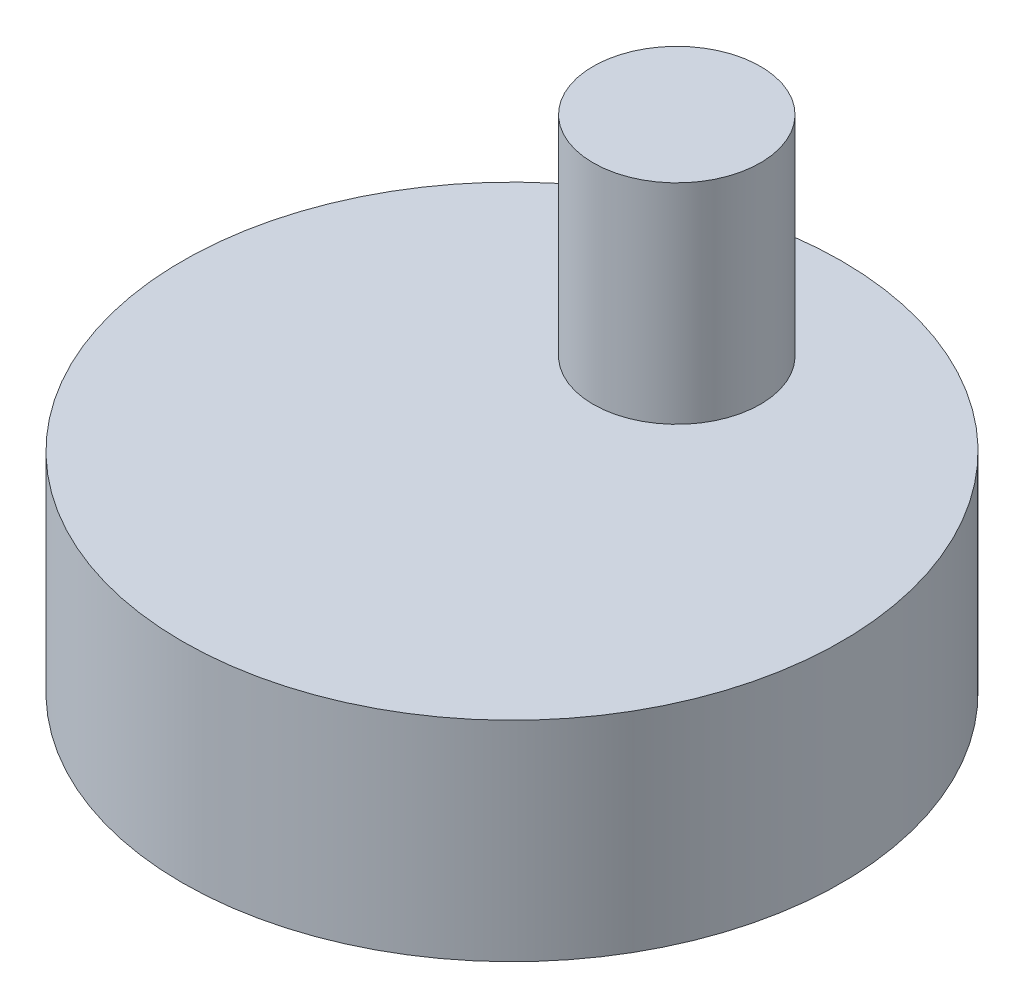
ISO-10303-21;
HEADER;
FILE_DESCRIPTION(('STEP AP214'),'2;1');
FILE_NAME('part.step','',(''),(''),'','','');
FILE_SCHEMA(('AUTOMOTIVE_DESIGN { 1 0 10303 214 1 1 1 1 }'));
ENDSEC;
DATA;
#1=APPLICATION_CONTEXT('core data for automotive mechanical design processes');
#2=APPLICATION_PROTOCOL_DEFINITION('international standard','automotive_design',2000,#1);
#3=PRODUCT_CONTEXT('',#1,'mechanical');
#4=PRODUCT('Part','Part','',(#3));
#5=PRODUCT_RELATED_PRODUCT_CATEGORY('part','',(#4));
#6=PRODUCT_DEFINITION_FORMATION('','',#4);
#7=PRODUCT_DEFINITION_CONTEXT('part definition',#1,'design');
#8=PRODUCT_DEFINITION('design','',#6,#7);
#9=PRODUCT_DEFINITION_SHAPE('','',#8);
#10=(LENGTH_UNIT() NAMED_UNIT(*) SI_UNIT(.MILLI.,.METRE.));
#11=(NAMED_UNIT(*) PLANE_ANGLE_UNIT() SI_UNIT($,.RADIAN.));
#12=(NAMED_UNIT(*) SI_UNIT($,.STERADIAN.) SOLID_ANGLE_UNIT());
#13=UNCERTAINTY_MEASURE_WITH_UNIT(LENGTH_MEASURE(1.E-05),#10,'distance_accuracy_value','');
#14=(GEOMETRIC_REPRESENTATION_CONTEXT(3) GLOBAL_UNCERTAINTY_ASSIGNED_CONTEXT((#13)) GLOBAL_UNIT_ASSIGNED_CONTEXT((#10,
#11,#12)) REPRESENTATION_CONTEXT('',''));
#15=CARTESIAN_POINT('',(0.,0.,0.));
#16=DIRECTION('',(0.,0.,1.));
#17=DIRECTION('',(1.,0.,0.));
#18=AXIS2_PLACEMENT_3D('',#15,#16,#17);
#19=CARTESIAN_POINT('',(0.,5.,0.));
#20=DIRECTION('',(0.,-1.,0.));
#21=DIRECTION('',(0.,0.,-1.));
#22=AXIS2_PLACEMENT_3D('',#19,#20,#21);
#23=CYLINDRICAL_SURFACE('',#22,7.88);
#24=CARTESIAN_POINT('',(0.,5.,0.));
#25=DIRECTION('',(0.,1.,0.));
#26=DIRECTION('',(0.,0.,1.));
#27=AXIS2_PLACEMENT_3D('',#24,#25,#26);
#28=CIRCLE('',#27,7.88);
#29=CARTESIAN_POINT('',(0.,5.,7.88));
#30=VERTEX_POINT('',#29);
#31=EDGE_CURVE('E10',#30,#30,#28,.T.);
#32=ORIENTED_EDGE('',*,*,#31,.F.);
#33=EDGE_LOOP('',(#32));
#34=FACE_BOUND('',#33,.T.);
#35=CARTESIAN_POINT('',(0.,0.,0.));
#36=DIRECTION('',(0.,1.,0.));
#37=DIRECTION('',(0.,0.,1.));
#38=AXIS2_PLACEMENT_3D('',#35,#36,#37);
#39=CIRCLE('',#38,7.88);
#40=CARTESIAN_POINT('',(0.,0.,7.88));
#41=VERTEX_POINT('',#40);
#42=EDGE_CURVE('E46',#41,#41,#39,.T.);
#43=ORIENTED_EDGE('',*,*,#42,.T.);
#44=EDGE_LOOP('',(#43));
#45=FACE_BOUND('',#44,.T.);
#46=ADVANCED_FACE('F43',(#34,#45),#23,.T.);
#47=CARTESIAN_POINT('',(0.,5.,0.));
#48=DIRECTION('',(0.,1.,0.));
#49=DIRECTION('',(0.,0.,1.));
#50=AXIS2_PLACEMENT_3D('',#47,#48,#49);
#51=PLANE('',#50);
#52=CARTESIAN_POINT('',(0.,5.,-3.94));
#53=DIRECTION('',(0.,1.,0.));
#54=DIRECTION('',(0.,0.,1.));
#55=AXIS2_PLACEMENT_3D('',#52,#53,#54);
#56=CIRCLE('',#55,2.);
#57=CARTESIAN_POINT('',(0.,5.,-1.94));
#58=VERTEX_POINT('',#57);
#59=EDGE_CURVE('E55',#58,#58,#56,.F.);
#60=ORIENTED_EDGE('',*,*,#59,.T.);
#61=EDGE_LOOP('',(#60));
#62=FACE_BOUND('',#61,.T.);
#63=ORIENTED_EDGE('',*,*,#31,.T.);
#64=EDGE_LOOP('',(#63));
#65=FACE_BOUND('',#64,.T.);
#66=ADVANCED_FACE('F77',(#62,#65),#51,.T.);
#67=CARTESIAN_POINT('',(0.,0.,0.));
#68=DIRECTION('',(0.,1.,0.));
#69=DIRECTION('',(0.,0.,1.));
#70=AXIS2_PLACEMENT_3D('',#67,#68,#69);
#71=PLANE('',#70);
#72=ORIENTED_EDGE('',*,*,#42,.F.);
#73=EDGE_LOOP('',(#72));
#74=FACE_BOUND('',#73,.T.);
#75=ADVANCED_FACE('F69',(#74),#71,.F.);
#76=CARTESIAN_POINT('',(0.,10.,-3.94));
#77=DIRECTION('',(0.,-1.,0.));
#78=DIRECTION('',(0.,0.,-1.));
#79=AXIS2_PLACEMENT_3D('',#76,#77,#78);
#80=CYLINDRICAL_SURFACE('',#79,2.);
#81=ORIENTED_EDGE('',*,*,#59,.F.);
#82=EDGE_LOOP('',(#81));
#83=FACE_BOUND('',#82,.T.);
#84=CARTESIAN_POINT('',(0.,10.,-3.94));
#85=DIRECTION('',(0.,1.,0.));
#86=DIRECTION('',(0.,0.,1.));
#87=AXIS2_PLACEMENT_3D('',#84,#85,#86);
#88=CIRCLE('',#87,2.);
#89=CARTESIAN_POINT('',(0.,10.,-1.94));
#90=VERTEX_POINT('',#89);
#91=EDGE_CURVE('E60',#90,#90,#88,.T.);
#92=ORIENTED_EDGE('',*,*,#91,.F.);
#93=EDGE_LOOP('',(#92));
#94=FACE_BOUND('',#93,.T.);
#95=ADVANCED_FACE('F67',(#83,#94),#80,.T.);
#96=CARTESIAN_POINT('',(0.,10.,-3.94));
#97=DIRECTION('',(0.,1.,0.));
#98=DIRECTION('',(0.,0.,1.));
#99=AXIS2_PLACEMENT_3D('',#96,#97,#98);
#100=PLANE('',#99);
#101=ORIENTED_EDGE('',*,*,#91,.T.);
#102=EDGE_LOOP('',(#101));
#103=FACE_BOUND('',#102,.T.);
#104=ADVANCED_FACE('F65',(#103),#100,.T.);
#105=CLOSED_SHELL('',(#46,#66,#75,#95,#104));
#106=MANIFOLD_SOLID_BREP('B2',#105);
#107=ADVANCED_BREP_SHAPE_REPRESENTATION('',(#18,#106),#14);
#108=SHAPE_DEFINITION_REPRESENTATION(#9,#107);
ENDSEC;
END-ISO-10303-21;
